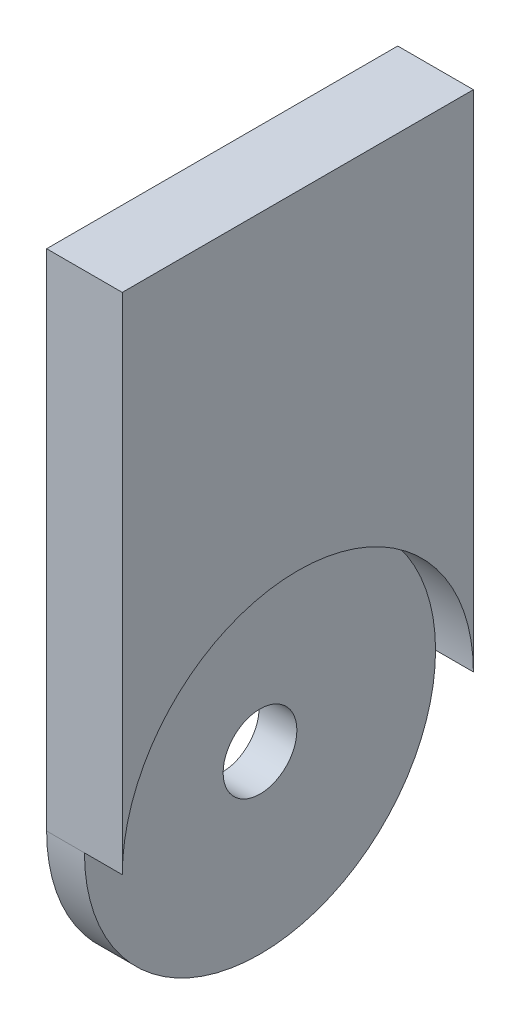
ISO-10303-21;
HEADER;
FILE_DESCRIPTION(('STEP AP214'),'2;1');
FILE_NAME('part.step','',(''),(''),'','','');
FILE_SCHEMA(('AUTOMOTIVE_DESIGN { 1 0 10303 214 1 1 1 1 }'));
ENDSEC;
DATA;
#1=APPLICATION_CONTEXT('core data for automotive mechanical design processes');
#2=APPLICATION_PROTOCOL_DEFINITION('international standard','automotive_design',2000,#1);
#3=PRODUCT_CONTEXT('',#1,'mechanical');
#4=PRODUCT('Part','Part','',(#3));
#5=PRODUCT_RELATED_PRODUCT_CATEGORY('part','',(#4));
#6=PRODUCT_DEFINITION_FORMATION('','',#4);
#7=PRODUCT_DEFINITION_CONTEXT('part definition',#1,'design');
#8=PRODUCT_DEFINITION('design','',#6,#7);
#9=PRODUCT_DEFINITION_SHAPE('','',#8);
#10=(LENGTH_UNIT() NAMED_UNIT(*) SI_UNIT(.MILLI.,.METRE.));
#11=(NAMED_UNIT(*) PLANE_ANGLE_UNIT() SI_UNIT($,.RADIAN.));
#12=(NAMED_UNIT(*) SI_UNIT($,.STERADIAN.) SOLID_ANGLE_UNIT());
#13=UNCERTAINTY_MEASURE_WITH_UNIT(LENGTH_MEASURE(1.E-05),#10,'distance_accuracy_value','');
#14=(GEOMETRIC_REPRESENTATION_CONTEXT(3) GLOBAL_UNCERTAINTY_ASSIGNED_CONTEXT((#13)) GLOBAL_UNIT_ASSIGNED_CONTEXT((#10,
#11,#12)) REPRESENTATION_CONTEXT('',''));
#15=CARTESIAN_POINT('',(0.,0.,0.));
#16=DIRECTION('',(0.,0.,1.));
#17=DIRECTION('',(1.,0.,0.));
#18=AXIS2_PLACEMENT_3D('',#15,#16,#17);
#19=CARTESIAN_POINT('',(6.,-1.10603448275862,1.44051724137931));
#20=DIRECTION('',(-1.,0.,0.));
#21=DIRECTION('',(0.,0.,1.));
#22=AXIS2_PLACEMENT_3D('',#19,#20,#21);
#23=CYLINDRICAL_SURFACE('',#22,13.925);
#24=DIRECTION('',(-1.,0.,0.));
#25=VECTOR('',#24,1.);
#26=CARTESIAN_POINT('',(6.,-1.10603448275862,-12.4844827586207));
#27=LINE('',#26,#25);
#28=CARTESIAN_POINT('',(3.,-1.10603448275862,-12.4844827586207));
#29=VERTEX_POINT('',#28);
#30=CARTESIAN_POINT('',(0.,-1.10603448275862,-12.4844827586207));
#31=VERTEX_POINT('',#30);
#32=EDGE_CURVE('E77',#29,#31,#27,.T.);
#33=ORIENTED_EDGE('',*,*,#32,.F.);
#34=CARTESIAN_POINT('',(3.,-1.10603448275862,1.44051724137931));
#35=DIRECTION('',(1.,0.,0.));
#36=DIRECTION('',(0.,0.,-1.));
#37=AXIS2_PLACEMENT_3D('',#34,#35,#36);
#38=CIRCLE('',#37,13.925);
#39=CARTESIAN_POINT('',(3.,-1.10603448275862,15.3655172413793));
#40=VERTEX_POINT('',#39);
#41=EDGE_CURVE('E91',#40,#29,#38,.T.);
#42=ORIENTED_EDGE('',*,*,#41,.F.);
#43=DIRECTION('',(-1.,0.,0.));
#44=VECTOR('',#43,1.);
#45=CARTESIAN_POINT('',(6.,-1.10603448275862,15.3655172413793));
#46=LINE('',#45,#44);
#47=CARTESIAN_POINT('',(0.,-1.10603448275862,15.3655172413793));
#48=VERTEX_POINT('',#47);
#49=EDGE_CURVE('E71',#40,#48,#46,.T.);
#50=ORIENTED_EDGE('',*,*,#49,.T.);
#51=CARTESIAN_POINT('',(0.,-1.10603448275862,1.44051724137931));
#52=DIRECTION('',(1.,0.,0.));
#53=DIRECTION('',(0.,0.,-1.));
#54=AXIS2_PLACEMENT_3D('',#51,#52,#53);
#55=CIRCLE('',#54,13.925);
#56=EDGE_CURVE('E101',#31,#48,#55,.F.);
#57=ORIENTED_EDGE('',*,*,#56,.F.);
#58=EDGE_LOOP('',(#33,#42,#50,#57));
#59=FACE_BOUND('',#58,.T.);
#60=ADVANCED_FACE('F35',(#59),#23,.T.);
#61=CARTESIAN_POINT('',(6.,0.,-12.4844827586207));
#62=DIRECTION('',(0.,0.,-1.));
#63=DIRECTION('',(0.,1.,0.));
#64=AXIS2_PLACEMENT_3D('',#61,#62,#63);
#65=PLANE('',#64);
#66=DIRECTION('',(0.,-1.,0.));
#67=VECTOR('',#66,1.);
#68=CARTESIAN_POINT('',(0.,0.,-12.4844827586207));
#69=LINE('',#68,#67);
#70=CARTESIAN_POINT('',(0.,38.8939655172414,-12.4844827586207));
#71=VERTEX_POINT('',#70);
#72=EDGE_CURVE('E99',#71,#31,#69,.T.);
#73=ORIENTED_EDGE('',*,*,#72,.F.);
#74=DIRECTION('',(-1.,0.,0.));
#75=VECTOR('',#74,1.);
#76=CARTESIAN_POINT('',(6.,38.8939655172414,-12.4844827586207));
#77=LINE('',#76,#75);
#78=CARTESIAN_POINT('',(6.,38.8939655172414,-12.4844827586207));
#79=VERTEX_POINT('',#78);
#80=EDGE_CURVE('E11',#79,#71,#77,.T.);
#81=ORIENTED_EDGE('',*,*,#80,.F.);
#82=DIRECTION('',(0.,-1.,0.));
#83=VECTOR('',#82,1.);
#84=CARTESIAN_POINT('',(6.,0.,-12.4844827586207));
#85=LINE('',#84,#83);
#86=CARTESIAN_POINT('',(6.,-1.10603448275862,-12.4844827586207));
#87=VERTEX_POINT('',#86);
#88=EDGE_CURVE('E104',#79,#87,#85,.T.);
#89=ORIENTED_EDGE('',*,*,#88,.T.);
#90=EDGE_CURVE('E53',#87,#29,#27,.T.);
#91=ORIENTED_EDGE('',*,*,#90,.T.);
#92=ORIENTED_EDGE('',*,*,#32,.T.);
#93=EDGE_LOOP('',(#73,#81,#89,#91,#92));
#94=FACE_BOUND('',#93,.T.);
#95=ADVANCED_FACE('F37',(#94),#65,.T.);
#96=CARTESIAN_POINT('',(6.,38.8939655172414,0.));
#97=DIRECTION('',(0.,1.,0.));
#98=DIRECTION('',(0.,0.,1.));
#99=AXIS2_PLACEMENT_3D('',#96,#97,#98);
#100=PLANE('',#99);
#101=DIRECTION('',(0.,0.,-1.));
#102=VECTOR('',#101,1.);
#103=CARTESIAN_POINT('',(0.,38.8939655172414,0.));
#104=LINE('',#103,#102);
#105=CARTESIAN_POINT('',(0.,38.8939655172414,15.3655172413793));
#106=VERTEX_POINT('',#105);
#107=EDGE_CURVE('E122',#106,#71,#104,.T.);
#108=ORIENTED_EDGE('',*,*,#107,.F.);
#109=DIRECTION('',(-1.,0.,0.));
#110=VECTOR('',#109,1.);
#111=CARTESIAN_POINT('',(6.,38.8939655172414,15.3655172413793));
#112=LINE('',#111,#110);
#113=CARTESIAN_POINT('',(6.,38.8939655172414,15.3655172413793));
#114=VERTEX_POINT('',#113);
#115=EDGE_CURVE('E45',#114,#106,#112,.T.);
#116=ORIENTED_EDGE('',*,*,#115,.F.);
#117=DIRECTION('',(0.,0.,-1.));
#118=VECTOR('',#117,1.);
#119=CARTESIAN_POINT('',(6.,38.8939655172414,0.));
#120=LINE('',#119,#118);
#121=EDGE_CURVE('E128',#114,#79,#120,.T.);
#122=ORIENTED_EDGE('',*,*,#121,.T.);
#123=ORIENTED_EDGE('',*,*,#80,.T.);
#124=EDGE_LOOP('',(#108,#116,#122,#123));
#125=FACE_BOUND('',#124,.T.);
#126=ADVANCED_FACE('F123',(#125),#100,.T.);
#127=CARTESIAN_POINT('',(6.,0.,15.3655172413793));
#128=DIRECTION('',(0.,0.,-1.));
#129=DIRECTION('',(0.,1.,0.));
#130=AXIS2_PLACEMENT_3D('',#127,#128,#129);
#131=PLANE('',#130);
#132=DIRECTION('',(0.,-1.,0.));
#133=VECTOR('',#132,1.);
#134=CARTESIAN_POINT('',(0.,0.,15.3655172413793));
#135=LINE('',#134,#133);
#136=EDGE_CURVE('E113',#106,#48,#135,.T.);
#137=ORIENTED_EDGE('',*,*,#136,.T.);
#138=ORIENTED_EDGE('',*,*,#49,.F.);
#139=CARTESIAN_POINT('',(6.,-1.10603448275862,15.3655172413793));
#140=VERTEX_POINT('',#139);
#141=EDGE_CURVE('E98',#140,#40,#46,.T.);
#142=ORIENTED_EDGE('',*,*,#141,.F.);
#143=DIRECTION('',(0.,-1.,0.));
#144=VECTOR('',#143,1.);
#145=CARTESIAN_POINT('',(6.,0.,15.3655172413793));
#146=LINE('',#145,#144);
#147=EDGE_CURVE('E102',#114,#140,#146,.T.);
#148=ORIENTED_EDGE('',*,*,#147,.F.);
#149=ORIENTED_EDGE('',*,*,#115,.T.);
#150=EDGE_LOOP('',(#137,#138,#142,#148,#149));
#151=FACE_BOUND('',#150,.T.);
#152=ADVANCED_FACE('F112',(#151),#131,.F.);
#153=CARTESIAN_POINT('',(6.,0.,0.));
#154=DIRECTION('',(1.,0.,0.));
#155=DIRECTION('',(0.,0.,-1.));
#156=AXIS2_PLACEMENT_3D('',#153,#154,#155);
#157=PLANE('',#156);
#158=CARTESIAN_POINT('',(6.,-1.10603448275862,1.44051724137931));
#159=DIRECTION('',(1.,0.,0.));
#160=DIRECTION('',(0.,0.,-1.));
#161=AXIS2_PLACEMENT_3D('',#158,#159,#160);
#162=CIRCLE('',#161,13.925);
#163=EDGE_CURVE('E94',#87,#140,#162,.T.);
#164=ORIENTED_EDGE('',*,*,#163,.F.);
#165=ORIENTED_EDGE('',*,*,#88,.F.);
#166=ORIENTED_EDGE('',*,*,#121,.F.);
#167=ORIENTED_EDGE('',*,*,#147,.T.);
#168=EDGE_LOOP('',(#164,#165,#166,#167));
#169=FACE_BOUND('',#168,.T.);
#170=ADVANCED_FACE('F160',(#169),#157,.T.);
#171=CARTESIAN_POINT('',(0.,0.,0.));
#172=DIRECTION('',(1.,0.,0.));
#173=DIRECTION('',(0.,0.,-1.));
#174=AXIS2_PLACEMENT_3D('',#171,#172,#173);
#175=PLANE('',#174);
#176=CARTESIAN_POINT('',(0.,-1.10603448275862,1.44051724137931));
#177=DIRECTION('',(-1.,0.,0.));
#178=DIRECTION('',(0.,0.,1.));
#179=AXIS2_PLACEMENT_3D('',#176,#177,#178);
#180=CIRCLE('',#179,2.925);
#181=CARTESIAN_POINT('',(0.,-1.10603448275862,4.36551724137931));
#182=VERTEX_POINT('',#181);
#183=EDGE_CURVE('E132',#182,#182,#180,.T.);
#184=ORIENTED_EDGE('',*,*,#183,.F.);
#185=EDGE_LOOP('',(#184));
#186=FACE_BOUND('',#185,.T.);
#187=ORIENTED_EDGE('',*,*,#72,.T.);
#188=ORIENTED_EDGE('',*,*,#56,.T.);
#189=ORIENTED_EDGE('',*,*,#136,.F.);
#190=ORIENTED_EDGE('',*,*,#107,.T.);
#191=EDGE_LOOP('',(#187,#188,#189,#190));
#192=FACE_BOUND('',#191,.T.);
#193=ADVANCED_FACE('F121',(#186,#192),#175,.F.);
#194=CARTESIAN_POINT('',(3.,-1.10603448275862,1.44051724137931));
#195=DIRECTION('',(1.,0.,0.));
#196=DIRECTION('',(0.,0.,-1.));
#197=AXIS2_PLACEMENT_3D('',#194,#195,#196);
#198=CYLINDRICAL_SURFACE('',#197,13.925);
#199=ORIENTED_EDGE('',*,*,#90,.F.);
#200=ORIENTED_EDGE('',*,*,#163,.T.);
#201=ORIENTED_EDGE('',*,*,#141,.T.);
#202=EDGE_CURVE('E93',#29,#40,#38,.T.);
#203=ORIENTED_EDGE('',*,*,#202,.F.);
#204=EDGE_LOOP('',(#199,#200,#201,#203));
#205=FACE_BOUND('',#204,.T.);
#206=ADVANCED_FACE('F96',(#205),#198,.F.);
#207=CARTESIAN_POINT('',(3.,-1.10603448275862,1.44051724137931));
#208=DIRECTION('',(1.,0.,0.));
#209=DIRECTION('',(0.,0.,-1.));
#210=AXIS2_PLACEMENT_3D('',#207,#208,#209);
#211=PLANE('',#210);
#212=CARTESIAN_POINT('',(3.,-1.10603448275862,1.44051724137931));
#213=DIRECTION('',(1.,0.,0.));
#214=DIRECTION('',(0.,0.,-1.));
#215=AXIS2_PLACEMENT_3D('',#212,#213,#214);
#216=CIRCLE('',#215,2.925);
#217=CARTESIAN_POINT('',(3.,-1.10603448275862,-1.48448275862069));
#218=VERTEX_POINT('',#217);
#219=EDGE_CURVE('E39',#218,#218,#216,.T.);
#220=ORIENTED_EDGE('',*,*,#219,.F.);
#221=EDGE_LOOP('',(#220));
#222=FACE_BOUND('',#221,.T.);
#223=ORIENTED_EDGE('',*,*,#202,.T.);
#224=ORIENTED_EDGE('',*,*,#41,.T.);
#225=EDGE_LOOP('',(#223,#224));
#226=FACE_BOUND('',#225,.T.);
#227=ADVANCED_FACE('F92',(#222,#226),#211,.T.);
#228=CARTESIAN_POINT('',(10.,-1.10603448275862,1.44051724137931));
#229=DIRECTION('',(-1.,0.,0.));
#230=DIRECTION('',(0.,0.,1.));
#231=AXIS2_PLACEMENT_3D('',#228,#229,#230);
#232=CYLINDRICAL_SURFACE('',#231,2.925);
#233=ORIENTED_EDGE('',*,*,#219,.T.);
#234=EDGE_LOOP('',(#233));
#235=FACE_BOUND('',#234,.T.);
#236=ORIENTED_EDGE('',*,*,#183,.T.);
#237=EDGE_LOOP('',(#236));
#238=FACE_BOUND('',#237,.T.);
#239=ADVANCED_FACE('F139',(#235,#238),#232,.F.);
#240=CLOSED_SHELL('',(#60,#95,#126,#152,#170,#193,#206,#227,#239));
#241=MANIFOLD_SOLID_BREP('B2',#240);
#242=ADVANCED_BREP_SHAPE_REPRESENTATION('',(#18,#241),#14);
#243=SHAPE_DEFINITION_REPRESENTATION(#9,#242);
ENDSEC;
END-ISO-10303-21;
